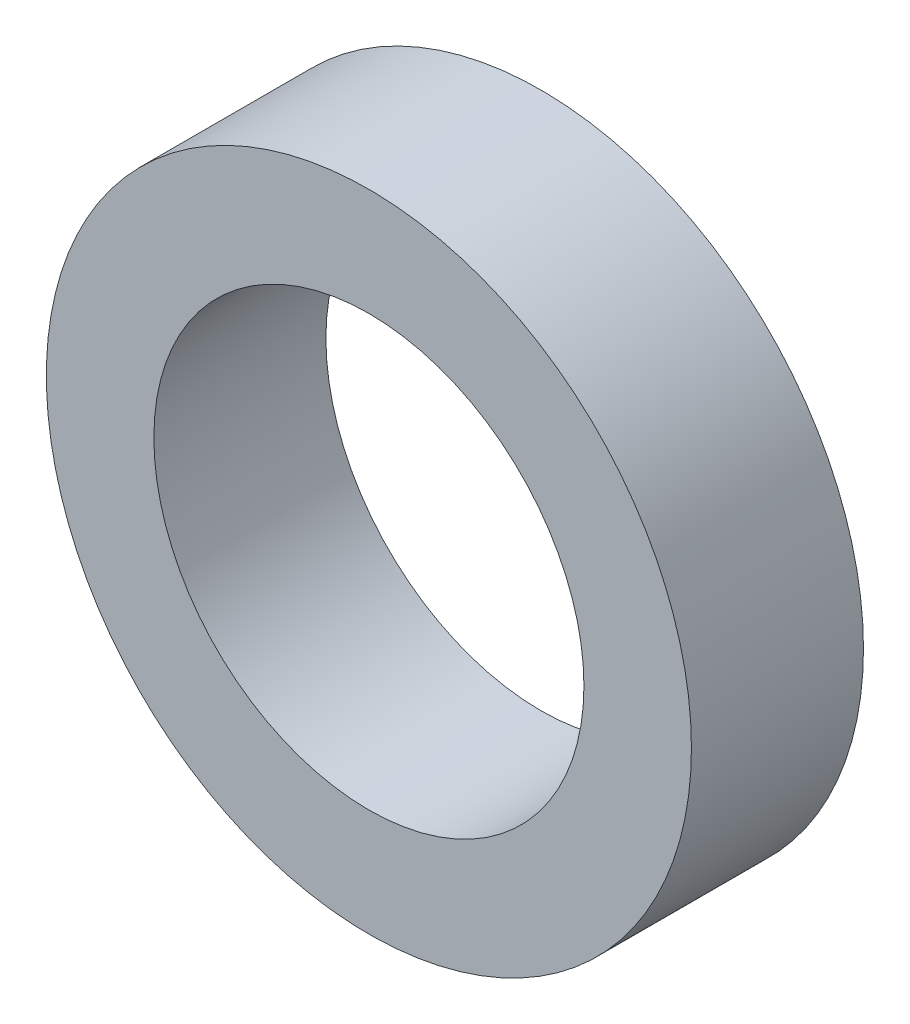
ISO-10303-21;
HEADER;
FILE_DESCRIPTION(('STEP AP214'),'2;1');
FILE_NAME('part.step','',(''),(''),'','','');
FILE_SCHEMA(('AUTOMOTIVE_DESIGN { 1 0 10303 214 1 1 1 1 }'));
ENDSEC;
DATA;
#1=APPLICATION_CONTEXT('core data for automotive mechanical design processes');
#2=APPLICATION_PROTOCOL_DEFINITION('international standard','automotive_design',2000,#1);
#3=PRODUCT_CONTEXT('',#1,'mechanical');
#4=PRODUCT('Part','Part','',(#3));
#5=PRODUCT_RELATED_PRODUCT_CATEGORY('part','',(#4));
#6=PRODUCT_DEFINITION_FORMATION('','',#4);
#7=PRODUCT_DEFINITION_CONTEXT('part definition',#1,'design');
#8=PRODUCT_DEFINITION('design','',#6,#7);
#9=PRODUCT_DEFINITION_SHAPE('','',#8);
#10=(LENGTH_UNIT() NAMED_UNIT(*) SI_UNIT(.MILLI.,.METRE.));
#11=(NAMED_UNIT(*) PLANE_ANGLE_UNIT() SI_UNIT($,.RADIAN.));
#12=(NAMED_UNIT(*) SI_UNIT($,.STERADIAN.) SOLID_ANGLE_UNIT());
#13=UNCERTAINTY_MEASURE_WITH_UNIT(LENGTH_MEASURE(1.E-05),#10,'distance_accuracy_value','');
#14=(GEOMETRIC_REPRESENTATION_CONTEXT(3) GLOBAL_UNCERTAINTY_ASSIGNED_CONTEXT((#13)) GLOBAL_UNIT_ASSIGNED_CONTEXT((#10,
#11,#12)) REPRESENTATION_CONTEXT('',''));
#15=CARTESIAN_POINT('',(0.,0.,0.));
#16=DIRECTION('',(0.,0.,1.));
#17=DIRECTION('',(1.,0.,0.));
#18=AXIS2_PLACEMENT_3D('',#15,#16,#17);
#19=CARTESIAN_POINT('',(0.,0.,4.));
#20=DIRECTION('',(0.,0.,1.));
#21=DIRECTION('',(1.,0.,0.));
#22=AXIS2_PLACEMENT_3D('',#19,#20,#21);
#23=PLANE('',#22);
#24=CARTESIAN_POINT('',(0.,0.,4.));
#25=DIRECTION('',(0.,0.,1.));
#26=DIRECTION('',(1.,0.,0.));
#27=AXIS2_PLACEMENT_3D('',#24,#25,#26);
#28=CIRCLE('',#27,7.5);
#29=CARTESIAN_POINT('',(7.5,0.,4.));
#30=VERTEX_POINT('',#29);
#31=EDGE_CURVE('E10',#30,#30,#28,.T.);
#32=ORIENTED_EDGE('',*,*,#31,.T.);
#33=EDGE_LOOP('',(#32));
#34=FACE_BOUND('',#33,.T.);
#35=CARTESIAN_POINT('',(0.,0.,4.));
#36=DIRECTION('',(0.,0.,1.));
#37=DIRECTION('',(1.,0.,0.));
#38=AXIS2_PLACEMENT_3D('',#35,#36,#37);
#39=CIRCLE('',#38,5.);
#40=CARTESIAN_POINT('',(5.,0.,4.));
#41=VERTEX_POINT('',#40);
#42=EDGE_CURVE('E56',#41,#41,#39,.T.);
#43=ORIENTED_EDGE('',*,*,#42,.F.);
#44=EDGE_LOOP('',(#43));
#45=FACE_BOUND('',#44,.T.);
#46=ADVANCED_FACE('F43',(#34,#45),#23,.T.);
#47=CARTESIAN_POINT('',(0.,0.,0.));
#48=DIRECTION('',(0.,0.,1.));
#49=DIRECTION('',(1.,0.,0.));
#50=AXIS2_PLACEMENT_3D('',#47,#48,#49);
#51=PLANE('',#50);
#52=CARTESIAN_POINT('',(0.,0.,0.));
#53=DIRECTION('',(0.,0.,1.));
#54=DIRECTION('',(1.,0.,0.));
#55=AXIS2_PLACEMENT_3D('',#52,#53,#54);
#56=CIRCLE('',#55,7.5);
#57=CARTESIAN_POINT('',(7.5,0.,0.));
#58=VERTEX_POINT('',#57);
#59=EDGE_CURVE('E47',#58,#58,#56,.T.);
#60=ORIENTED_EDGE('',*,*,#59,.F.);
#61=EDGE_LOOP('',(#60));
#62=FACE_BOUND('',#61,.T.);
#63=CARTESIAN_POINT('',(0.,0.,0.));
#64=DIRECTION('',(0.,0.,1.));
#65=DIRECTION('',(1.,0.,0.));
#66=AXIS2_PLACEMENT_3D('',#63,#64,#65);
#67=CIRCLE('',#66,5.);
#68=CARTESIAN_POINT('',(5.,0.,0.));
#69=VERTEX_POINT('',#68);
#70=EDGE_CURVE('E58',#69,#69,#67,.T.);
#71=ORIENTED_EDGE('',*,*,#70,.T.);
#72=EDGE_LOOP('',(#71));
#73=FACE_BOUND('',#72,.T.);
#74=ADVANCED_FACE('F70',(#62,#73),#51,.F.);
#75=CARTESIAN_POINT('',(0.,0.,4.));
#76=DIRECTION('',(0.,0.,-1.));
#77=DIRECTION('',(-1.,0.,0.));
#78=AXIS2_PLACEMENT_3D('',#75,#76,#77);
#79=CYLINDRICAL_SURFACE('',#78,7.5);
#80=ORIENTED_EDGE('',*,*,#31,.F.);
#81=EDGE_LOOP('',(#80));
#82=FACE_BOUND('',#81,.T.);
#83=ORIENTED_EDGE('',*,*,#59,.T.);
#84=EDGE_LOOP('',(#83));
#85=FACE_BOUND('',#84,.T.);
#86=ADVANCED_FACE('F45',(#82,#85),#79,.T.);
#87=CARTESIAN_POINT('',(0.,0.,4.));
#88=DIRECTION('',(0.,0.,-1.));
#89=DIRECTION('',(-1.,0.,0.));
#90=AXIS2_PLACEMENT_3D('',#87,#88,#89);
#91=CYLINDRICAL_SURFACE('',#90,5.);
#92=ORIENTED_EDGE('',*,*,#42,.T.);
#93=EDGE_LOOP('',(#92));
#94=FACE_BOUND('',#93,.T.);
#95=ORIENTED_EDGE('',*,*,#70,.F.);
#96=EDGE_LOOP('',(#95));
#97=FACE_BOUND('',#96,.T.);
#98=ADVANCED_FACE('F66',(#94,#97),#91,.F.);
#99=CLOSED_SHELL('',(#46,#74,#86,#98));
#100=MANIFOLD_SOLID_BREP('B2',#99);
#101=ADVANCED_BREP_SHAPE_REPRESENTATION('',(#18,#100),#14);
#102=SHAPE_DEFINITION_REPRESENTATION(#9,#101);
ENDSEC;
END-ISO-10303-21;
